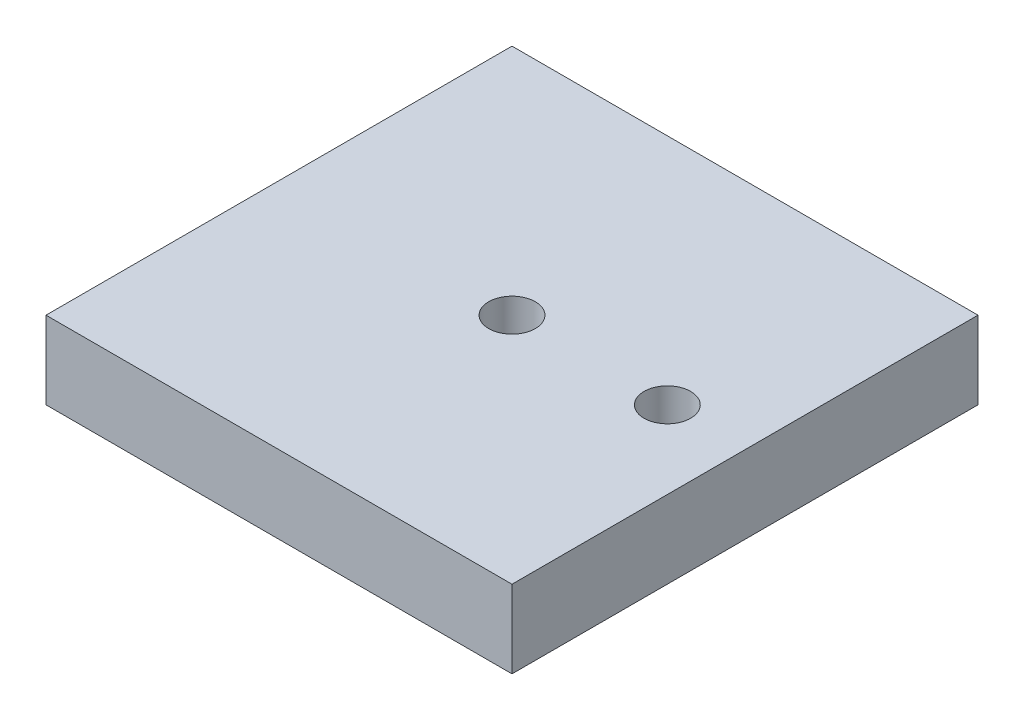
ISO-10303-21;
HEADER;
FILE_DESCRIPTION(('STEP AP214'),'2;1');
FILE_NAME('part.step','',(''),(''),'','','');
FILE_SCHEMA(('AUTOMOTIVE_DESIGN { 1 0 10303 214 1 1 1 1 }'));
ENDSEC;
DATA;
#1=APPLICATION_CONTEXT('core data for automotive mechanical design processes');
#2=APPLICATION_PROTOCOL_DEFINITION('international standard','automotive_design',2000,#1);
#3=PRODUCT_CONTEXT('',#1,'mechanical');
#4=PRODUCT('Part','Part','',(#3));
#5=PRODUCT_RELATED_PRODUCT_CATEGORY('part','',(#4));
#6=PRODUCT_DEFINITION_FORMATION('','',#4);
#7=PRODUCT_DEFINITION_CONTEXT('part definition',#1,'design');
#8=PRODUCT_DEFINITION('design','',#6,#7);
#9=PRODUCT_DEFINITION_SHAPE('','',#8);
#10=(LENGTH_UNIT() NAMED_UNIT(*) SI_UNIT(.MILLI.,.METRE.));
#11=(NAMED_UNIT(*) PLANE_ANGLE_UNIT() SI_UNIT($,.RADIAN.));
#12=(NAMED_UNIT(*) SI_UNIT($,.STERADIAN.) SOLID_ANGLE_UNIT());
#13=UNCERTAINTY_MEASURE_WITH_UNIT(LENGTH_MEASURE(1.E-05),#10,'distance_accuracy_value','');
#14=(GEOMETRIC_REPRESENTATION_CONTEXT(3) GLOBAL_UNCERTAINTY_ASSIGNED_CONTEXT((#13)) GLOBAL_UNIT_ASSIGNED_CONTEXT((#10,
#11,#12)) REPRESENTATION_CONTEXT('',''));
#15=CARTESIAN_POINT('',(0.,0.,0.));
#16=DIRECTION('',(0.,0.,1.));
#17=DIRECTION('',(1.,0.,0.));
#18=AXIS2_PLACEMENT_3D('',#15,#16,#17);
#19=CARTESIAN_POINT('',(-30.,10.,-30.));
#20=DIRECTION('',(1.,0.,0.));
#21=DIRECTION('',(0.,0.,-1.));
#22=AXIS2_PLACEMENT_3D('',#19,#20,#21);
#23=PLANE('',#22);
#24=DIRECTION('',(0.,0.,1.));
#25=VECTOR('',#24,1.);
#26=CARTESIAN_POINT('',(-30.,0.,-30.));
#27=LINE('',#26,#25);
#28=CARTESIAN_POINT('',(-30.,0.,-30.));
#29=VERTEX_POINT('',#28);
#30=CARTESIAN_POINT('',(-30.,0.,30.));
#31=VERTEX_POINT('',#30);
#32=EDGE_CURVE('E113',#29,#31,#27,.T.);
#33=ORIENTED_EDGE('',*,*,#32,.T.);
#34=DIRECTION('',(0.,-1.,0.));
#35=VECTOR('',#34,1.);
#36=CARTESIAN_POINT('',(-30.,10.,30.));
#37=LINE('',#36,#35);
#38=CARTESIAN_POINT('',(-30.,10.,30.));
#39=VERTEX_POINT('',#38);
#40=EDGE_CURVE('E11',#39,#31,#37,.T.);
#41=ORIENTED_EDGE('',*,*,#40,.F.);
#42=DIRECTION('',(0.,0.,1.));
#43=VECTOR('',#42,1.);
#44=CARTESIAN_POINT('',(-30.,10.,-30.));
#45=LINE('',#44,#43);
#46=CARTESIAN_POINT('',(-30.,10.,-30.));
#47=VERTEX_POINT('',#46);
#48=EDGE_CURVE('E97',#47,#39,#45,.T.);
#49=ORIENTED_EDGE('',*,*,#48,.F.);
#50=DIRECTION('',(0.,-1.,0.));
#51=VECTOR('',#50,1.);
#52=CARTESIAN_POINT('',(-30.,10.,-30.));
#53=LINE('',#52,#51);
#54=EDGE_CURVE('E109',#47,#29,#53,.T.);
#55=ORIENTED_EDGE('',*,*,#54,.T.);
#56=EDGE_LOOP('',(#33,#41,#49,#55));
#57=FACE_BOUND('',#56,.T.);
#58=ADVANCED_FACE('F45',(#57),#23,.F.);
#59=CARTESIAN_POINT('',(30.,10.,30.));
#60=DIRECTION('',(0.,0.,-1.));
#61=DIRECTION('',(-1.,0.,0.));
#62=AXIS2_PLACEMENT_3D('',#59,#60,#61);
#63=PLANE('',#62);
#64=DIRECTION('',(1.,0.,0.));
#65=VECTOR('',#64,1.);
#66=CARTESIAN_POINT('',(30.,0.,30.));
#67=LINE('',#66,#65);
#68=CARTESIAN_POINT('',(30.,0.,30.));
#69=VERTEX_POINT('',#68);
#70=EDGE_CURVE('E102',#31,#69,#67,.T.);
#71=ORIENTED_EDGE('',*,*,#70,.T.);
#72=DIRECTION('',(0.,-1.,0.));
#73=VECTOR('',#72,1.);
#74=CARTESIAN_POINT('',(30.,10.,30.));
#75=LINE('',#74,#73);
#76=CARTESIAN_POINT('',(30.,10.,30.));
#77=VERTEX_POINT('',#76);
#78=EDGE_CURVE('E54',#77,#69,#75,.T.);
#79=ORIENTED_EDGE('',*,*,#78,.F.);
#80=DIRECTION('',(1.,0.,0.));
#81=VECTOR('',#80,1.);
#82=CARTESIAN_POINT('',(30.,10.,30.));
#83=LINE('',#82,#81);
#84=EDGE_CURVE('E92',#39,#77,#83,.T.);
#85=ORIENTED_EDGE('',*,*,#84,.F.);
#86=ORIENTED_EDGE('',*,*,#40,.T.);
#87=EDGE_LOOP('',(#71,#79,#85,#86));
#88=FACE_BOUND('',#87,.T.);
#89=ADVANCED_FACE('F101',(#88),#63,.F.);
#90=CARTESIAN_POINT('',(30.,10.,-30.));
#91=DIRECTION('',(-1.,0.,0.));
#92=DIRECTION('',(0.,0.,1.));
#93=AXIS2_PLACEMENT_3D('',#90,#91,#92);
#94=PLANE('',#93);
#95=DIRECTION('',(0.,0.,-1.));
#96=VECTOR('',#95,1.);
#97=CARTESIAN_POINT('',(30.,0.,-30.));
#98=LINE('',#97,#96);
#99=CARTESIAN_POINT('',(30.,0.,-30.));
#100=VERTEX_POINT('',#99);
#101=EDGE_CURVE('E79',#69,#100,#98,.T.);
#102=ORIENTED_EDGE('',*,*,#101,.T.);
#103=DIRECTION('',(0.,-1.,0.));
#104=VECTOR('',#103,1.);
#105=CARTESIAN_POINT('',(30.,10.,-30.));
#106=LINE('',#105,#104);
#107=CARTESIAN_POINT('',(30.,10.,-30.));
#108=VERTEX_POINT('',#107);
#109=EDGE_CURVE('E104',#108,#100,#106,.T.);
#110=ORIENTED_EDGE('',*,*,#109,.F.);
#111=DIRECTION('',(0.,0.,-1.));
#112=VECTOR('',#111,1.);
#113=CARTESIAN_POINT('',(30.,10.,-30.));
#114=LINE('',#113,#112);
#115=EDGE_CURVE('E95',#77,#108,#114,.T.);
#116=ORIENTED_EDGE('',*,*,#115,.F.);
#117=ORIENTED_EDGE('',*,*,#78,.T.);
#118=EDGE_LOOP('',(#102,#110,#116,#117));
#119=FACE_BOUND('',#118,.T.);
#120=ADVANCED_FACE('F105',(#119),#94,.F.);
#121=CARTESIAN_POINT('',(30.,10.,-30.));
#122=DIRECTION('',(0.,0.,1.));
#123=DIRECTION('',(1.,0.,0.));
#124=AXIS2_PLACEMENT_3D('',#121,#122,#123);
#125=PLANE('',#124);
#126=DIRECTION('',(-1.,0.,0.));
#127=VECTOR('',#126,1.);
#128=CARTESIAN_POINT('',(30.,0.,-30.));
#129=LINE('',#128,#127);
#130=EDGE_CURVE('E85',#100,#29,#129,.T.);
#131=ORIENTED_EDGE('',*,*,#130,.T.);
#132=ORIENTED_EDGE('',*,*,#54,.F.);
#133=DIRECTION('',(-1.,0.,0.));
#134=VECTOR('',#133,1.);
#135=CARTESIAN_POINT('',(30.,10.,-30.));
#136=LINE('',#135,#134);
#137=EDGE_CURVE('E62',#108,#47,#136,.T.);
#138=ORIENTED_EDGE('',*,*,#137,.F.);
#139=ORIENTED_EDGE('',*,*,#109,.T.);
#140=EDGE_LOOP('',(#131,#132,#138,#139));
#141=FACE_BOUND('',#140,.T.);
#142=ADVANCED_FACE('F127',(#141),#125,.F.);
#143=CARTESIAN_POINT('',(0.,10.,0.));
#144=DIRECTION('',(0.,-1.,0.));
#145=DIRECTION('',(0.,0.,-1.));
#146=AXIS2_PLACEMENT_3D('',#143,#144,#145);
#147=PLANE('',#146);
#148=CARTESIAN_POINT('',(20.,10.,0.));
#149=DIRECTION('',(0.,1.,0.));
#150=DIRECTION('',(0.,0.,1.));
#151=AXIS2_PLACEMENT_3D('',#148,#149,#150);
#152=CIRCLE('',#151,3.);
#153=CARTESIAN_POINT('',(20.,10.,3.));
#154=VERTEX_POINT('',#153);
#155=EDGE_CURVE('E142',#154,#154,#152,.T.);
#156=ORIENTED_EDGE('',*,*,#155,.F.);
#157=EDGE_LOOP('',(#156));
#158=FACE_BOUND('',#157,.T.);
#159=CARTESIAN_POINT('',(0.,10.,0.));
#160=DIRECTION('',(0.,1.,0.));
#161=DIRECTION('',(0.,0.,1.));
#162=AXIS2_PLACEMENT_3D('',#159,#160,#161);
#163=CIRCLE('',#162,3.);
#164=CARTESIAN_POINT('',(0.,10.,3.));
#165=VERTEX_POINT('',#164);
#166=EDGE_CURVE('E138',#165,#165,#163,.T.);
#167=ORIENTED_EDGE('',*,*,#166,.F.);
#168=EDGE_LOOP('',(#167));
#169=FACE_BOUND('',#168,.T.);
#170=ORIENTED_EDGE('',*,*,#48,.T.);
#171=ORIENTED_EDGE('',*,*,#84,.T.);
#172=ORIENTED_EDGE('',*,*,#115,.T.);
#173=ORIENTED_EDGE('',*,*,#137,.T.);
#174=EDGE_LOOP('',(#170,#171,#172,#173));
#175=FACE_BOUND('',#174,.T.);
#176=ADVANCED_FACE('F93',(#158,#169,#175),#147,.F.);
#177=CARTESIAN_POINT('',(0.,0.,0.));
#178=DIRECTION('',(0.,-1.,0.));
#179=DIRECTION('',(0.,0.,-1.));
#180=AXIS2_PLACEMENT_3D('',#177,#178,#179);
#181=PLANE('',#180);
#182=CARTESIAN_POINT('',(20.,0.,0.));
#183=DIRECTION('',(0.,1.,0.));
#184=DIRECTION('',(0.,0.,1.));
#185=AXIS2_PLACEMENT_3D('',#182,#183,#184);
#186=CIRCLE('',#185,3.);
#187=CARTESIAN_POINT('',(20.,0.,3.));
#188=VERTEX_POINT('',#187);
#189=EDGE_CURVE('E117',#188,#188,#186,.T.);
#190=ORIENTED_EDGE('',*,*,#189,.T.);
#191=EDGE_LOOP('',(#190));
#192=FACE_BOUND('',#191,.T.);
#193=CARTESIAN_POINT('',(0.,0.,0.));
#194=DIRECTION('',(0.,1.,0.));
#195=DIRECTION('',(0.,0.,1.));
#196=AXIS2_PLACEMENT_3D('',#193,#194,#195);
#197=CIRCLE('',#196,3.);
#198=CARTESIAN_POINT('',(0.,0.,3.));
#199=VERTEX_POINT('',#198);
#200=EDGE_CURVE('E134',#199,#199,#197,.T.);
#201=ORIENTED_EDGE('',*,*,#200,.T.);
#202=EDGE_LOOP('',(#201));
#203=FACE_BOUND('',#202,.T.);
#204=ORIENTED_EDGE('',*,*,#32,.F.);
#205=ORIENTED_EDGE('',*,*,#130,.F.);
#206=ORIENTED_EDGE('',*,*,#101,.F.);
#207=ORIENTED_EDGE('',*,*,#70,.F.);
#208=EDGE_LOOP('',(#204,#205,#206,#207));
#209=FACE_BOUND('',#208,.T.);
#210=ADVANCED_FACE('F130',(#192,#203,#209),#181,.T.);
#211=CARTESIAN_POINT('',(0.,0.,0.));
#212=DIRECTION('',(0.,1.,0.));
#213=DIRECTION('',(0.,0.,1.));
#214=AXIS2_PLACEMENT_3D('',#211,#212,#213);
#215=CYLINDRICAL_SURFACE('',#214,3.);
#216=ORIENTED_EDGE('',*,*,#200,.F.);
#217=EDGE_LOOP('',(#216));
#218=FACE_BOUND('',#217,.T.);
#219=ORIENTED_EDGE('',*,*,#166,.T.);
#220=EDGE_LOOP('',(#219));
#221=FACE_BOUND('',#220,.T.);
#222=ADVANCED_FACE('F155',(#218,#221),#215,.F.);
#223=CARTESIAN_POINT('',(20.,0.,0.));
#224=DIRECTION('',(0.,1.,0.));
#225=DIRECTION('',(0.,0.,1.));
#226=AXIS2_PLACEMENT_3D('',#223,#224,#225);
#227=CYLINDRICAL_SURFACE('',#226,3.);
#228=ORIENTED_EDGE('',*,*,#189,.F.);
#229=EDGE_LOOP('',(#228));
#230=FACE_BOUND('',#229,.T.);
#231=ORIENTED_EDGE('',*,*,#155,.T.);
#232=EDGE_LOOP('',(#231));
#233=FACE_BOUND('',#232,.T.);
#234=ADVANCED_FACE('F152',(#230,#233),#227,.F.);
#235=CLOSED_SHELL('',(#58,#89,#120,#142,#176,#210,#222,#234));
#236=MANIFOLD_SOLID_BREP('B2',#235);
#237=ADVANCED_BREP_SHAPE_REPRESENTATION('',(#18,#236),#14);
#238=SHAPE_DEFINITION_REPRESENTATION(#9,#237);
ENDSEC;
END-ISO-10303-21;
